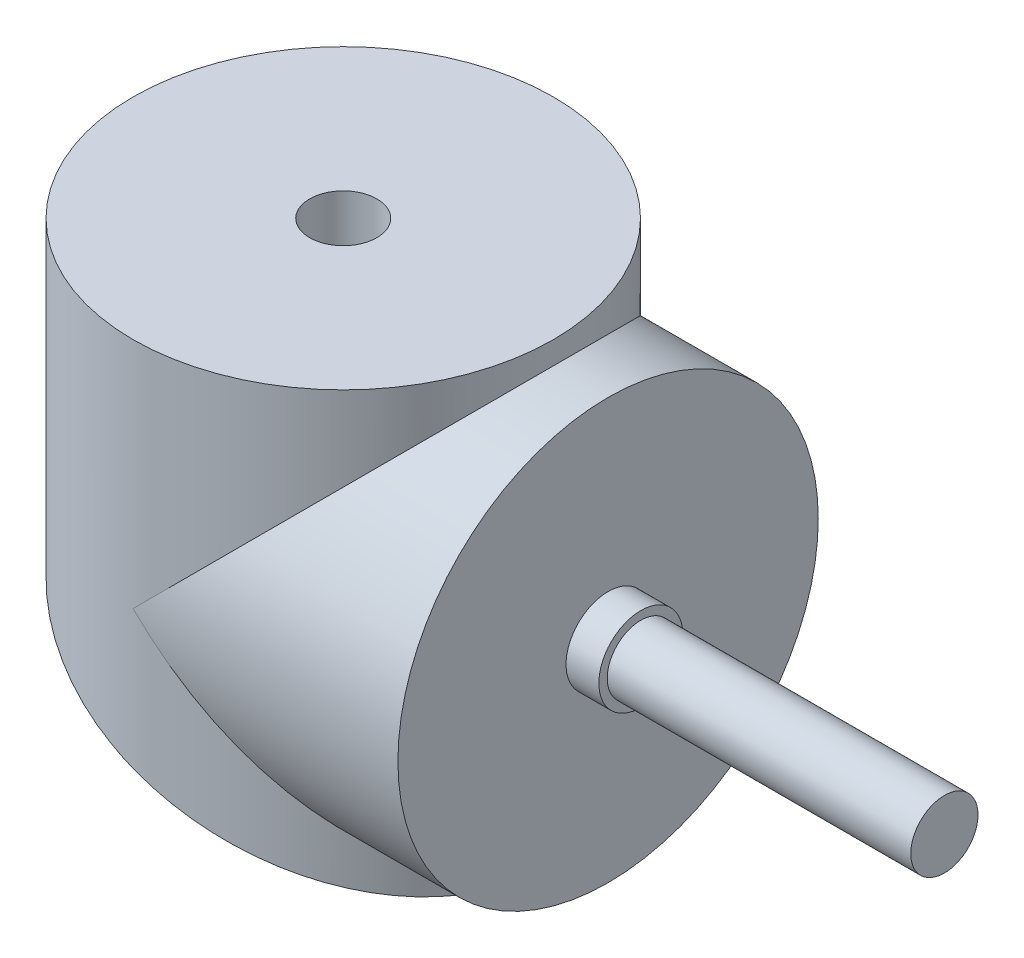
ISO-10303-21;
HEADER;
FILE_DESCRIPTION(('STEP AP214'),'2;1');
FILE_NAME('part.step','',(''),(''),'','','');
FILE_SCHEMA(('AUTOMOTIVE_DESIGN { 1 0 10303 214 1 1 1 1 }'));
ENDSEC;
DATA;
#1=APPLICATION_CONTEXT('core data for automotive mechanical design processes');
#2=APPLICATION_PROTOCOL_DEFINITION('international standard','automotive_design',2000,#1);
#3=PRODUCT_CONTEXT('',#1,'mechanical');
#4=PRODUCT('Part','Part','',(#3));
#5=PRODUCT_RELATED_PRODUCT_CATEGORY('part','',(#4));
#6=PRODUCT_DEFINITION_FORMATION('','',#4);
#7=PRODUCT_DEFINITION_CONTEXT('part definition',#1,'design');
#8=PRODUCT_DEFINITION('design','',#6,#7);
#9=PRODUCT_DEFINITION_SHAPE('','',#8);
#10=(LENGTH_UNIT() NAMED_UNIT(*) SI_UNIT(.MILLI.,.METRE.));
#11=(NAMED_UNIT(*) PLANE_ANGLE_UNIT() SI_UNIT($,.RADIAN.));
#12=(NAMED_UNIT(*) SI_UNIT($,.STERADIAN.) SOLID_ANGLE_UNIT());
#13=UNCERTAINTY_MEASURE_WITH_UNIT(LENGTH_MEASURE(1.E-05),#10,'distance_accuracy_value','');
#14=(GEOMETRIC_REPRESENTATION_CONTEXT(3) GLOBAL_UNCERTAINTY_ASSIGNED_CONTEXT((#13)) GLOBAL_UNIT_ASSIGNED_CONTEXT((#10,
#11,#12)) REPRESENTATION_CONTEXT('',''));
#15=CARTESIAN_POINT('',(0.,0.,0.));
#16=DIRECTION('',(0.,0.,1.));
#17=DIRECTION('',(1.,0.,0.));
#18=AXIS2_PLACEMENT_3D('',#15,#16,#17);
#19=CARTESIAN_POINT('',(0.,-39.70459341,0.));
#20=DIRECTION('',(0.,1.,0.));
#21=DIRECTION('',(0.,0.,1.));
#22=AXIS2_PLACEMENT_3D('',#19,#20,#21);
#23=CYLINDRICAL_SURFACE('',#22,37.5);
#24=CARTESIAN_POINT('',(0.,-24.7045790352276,0.));
#25=DIRECTION('',(0.371390983173378,0.928476568157491,0.));
#26=DIRECTION('',(-0.928476568157491,0.371390983173378,0.));
#27=AXIS2_PLACEMENT_3D('',#24,#25,#26);
#28=ELLIPSE('',#27,40.3887413921674,37.5);
#29=CARTESIAN_POINT('',(-37.5,-9.70456466045524,0.));
#30=VERTEX_POINT('',#29);
#31=EDGE_CURVE('E81',#30,#30,#28,.F.);
#32=ORIENTED_EDGE('',*,*,#31,.F.);
#33=EDGE_LOOP('',(#32));
#34=FACE_BOUND('',#33,.T.);
#35=CARTESIAN_POINT('',(0.,41.55,0.));
#36=DIRECTION('',(0.,1.,0.));
#37=DIRECTION('',(0.,0.,1.));
#38=AXIS2_PLACEMENT_3D('',#35,#36,#37);
#39=CIRCLE('',#38,37.5);
#40=CARTESIAN_POINT('',(0.,41.55,37.5));
#41=VERTEX_POINT('',#40);
#42=EDGE_CURVE('E66',#41,#41,#39,.T.);
#43=ORIENTED_EDGE('',*,*,#42,.F.);
#44=EDGE_LOOP('',(#43));
#45=FACE_BOUND('',#44,.T.);
#46=CARTESIAN_POINT('',(0.,0.,0.));
#47=DIRECTION('',(-0.707106781186547,0.707106781186547,0.));
#48=DIRECTION('',(-0.707106781186547,-0.707106781186547,0.));
#49=AXIS2_PLACEMENT_3D('',#46,#47,#48);
#50=ELLIPSE('',#49,53.0330085889911,37.5);
#51=CARTESIAN_POINT('',(0.,0.,-37.5));
#52=VERTEX_POINT('',#51);
#53=CARTESIAN_POINT('',(0.,0.,37.5));
#54=VERTEX_POINT('',#53);
#55=EDGE_CURVE('E55',#52,#54,#50,.F.);
#56=ORIENTED_EDGE('',*,*,#55,.F.);
#57=CARTESIAN_POINT('',(0.,0.,0.));
#58=DIRECTION('',(-0.707106781186547,-0.707106781186547,0.));
#59=DIRECTION('',(-0.707106781186547,0.707106781186547,0.));
#60=AXIS2_PLACEMENT_3D('',#57,#58,#59);
#61=ELLIPSE('',#60,53.0330085889911,37.5);
#62=EDGE_CURVE('E63',#54,#52,#61,.F.);
#63=ORIENTED_EDGE('',*,*,#62,.F.);
#64=EDGE_LOOP('',(#56,#63));
#65=FACE_BOUND('',#64,.T.);
#66=ADVANCED_FACE('F45',(#34,#45,#65),#23,.T.);
#67=CARTESIAN_POINT('',(0.,41.55,0.));
#68=DIRECTION('',(0.,1.,0.));
#69=DIRECTION('',(0.,0.,1.));
#70=AXIS2_PLACEMENT_3D('',#67,#68,#69);
#71=PLANE('',#70);
#72=CARTESIAN_POINT('',(0.,41.55,0.));
#73=DIRECTION('',(0.,1.,0.));
#74=DIRECTION('',(0.,0.,1.));
#75=AXIS2_PLACEMENT_3D('',#72,#73,#74);
#76=CIRCLE('',#75,6.);
#77=CARTESIAN_POINT('',(0.,41.55,-6.));
#78=VERTEX_POINT('',#77);
#79=EDGE_CURVE('E49',#78,#78,#76,.F.);
#80=ORIENTED_EDGE('',*,*,#79,.T.);
#81=EDGE_LOOP('',(#80));
#82=FACE_BOUND('',#81,.T.);
#83=ORIENTED_EDGE('',*,*,#42,.T.);
#84=EDGE_LOOP('',(#83));
#85=FACE_BOUND('',#84,.T.);
#86=ADVANCED_FACE('F100',(#82,#85),#71,.T.);
#87=CARTESIAN_POINT('',(47.25,0.,0.));
#88=DIRECTION('',(-1.,0.,0.));
#89=DIRECTION('',(0.,0.,1.));
#90=AXIS2_PLACEMENT_3D('',#87,#88,#89);
#91=CYLINDRICAL_SURFACE('',#90,37.5);
#92=CARTESIAN_POINT('',(47.25,0.,0.));
#93=DIRECTION('',(1.,0.,0.));
#94=DIRECTION('',(0.,0.,-1.));
#95=AXIS2_PLACEMENT_3D('',#92,#93,#94);
#96=CIRCLE('',#95,37.5);
#97=CARTESIAN_POINT('',(47.25,0.,-37.5));
#98=VERTEX_POINT('',#97);
#99=EDGE_CURVE('E11',#98,#98,#96,.T.);
#100=ORIENTED_EDGE('',*,*,#99,.F.);
#101=EDGE_LOOP('',(#100));
#102=FACE_BOUND('',#101,.T.);
#103=ORIENTED_EDGE('',*,*,#62,.T.);
#104=ORIENTED_EDGE('',*,*,#55,.T.);
#105=EDGE_LOOP('',(#103,#104));
#106=FACE_BOUND('',#105,.T.);
#107=ADVANCED_FACE('F47',(#102,#106),#91,.T.);
#108=CARTESIAN_POINT('',(47.25,0.,0.));
#109=DIRECTION('',(1.,0.,0.));
#110=DIRECTION('',(0.,0.,-1.));
#111=AXIS2_PLACEMENT_3D('',#108,#109,#110);
#112=PLANE('',#111);
#113=CARTESIAN_POINT('',(47.25,0.,0.));
#114=DIRECTION('',(1.,0.,0.));
#115=DIRECTION('',(0.,0.,-1.));
#116=AXIS2_PLACEMENT_3D('',#113,#114,#115);
#117=CIRCLE('',#116,7.5);
#118=CARTESIAN_POINT('',(47.25,0.,-7.5));
#119=VERTEX_POINT('',#118);
#120=EDGE_CURVE('E84',#119,#119,#117,.T.);
#121=ORIENTED_EDGE('',*,*,#120,.F.);
#122=EDGE_LOOP('',(#121));
#123=FACE_BOUND('',#122,.T.);
#124=ORIENTED_EDGE('',*,*,#99,.T.);
#125=EDGE_LOOP('',(#124));
#126=FACE_BOUND('',#125,.T.);
#127=ADVANCED_FACE('F114',(#123,#126),#112,.T.);
#128=CARTESIAN_POINT('',(-37.5,-9.70456466045523,-37.5));
#129=DIRECTION('',(0.371390983173378,0.928476568157491,0.));
#130=DIRECTION('',(-0.928476568157491,0.371390983173378,0.));
#131=AXIS2_PLACEMENT_3D('',#128,#129,#130);
#132=PLANE('',#131);
#133=ORIENTED_EDGE('',*,*,#31,.T.);
#134=EDGE_LOOP('',(#133));
#135=FACE_BOUND('',#134,.T.);
#136=ADVANCED_FACE('F116',(#135),#132,.F.);
#137=CARTESIAN_POINT('',(53.1,0.,0.));
#138=DIRECTION('',(-1.,0.,0.));
#139=DIRECTION('',(0.,0.,1.));
#140=AXIS2_PLACEMENT_3D('',#137,#138,#139);
#141=CYLINDRICAL_SURFACE('',#140,7.5);
#142=CARTESIAN_POINT('',(53.1,0.,0.));
#143=DIRECTION('',(1.,0.,0.));
#144=DIRECTION('',(0.,0.,-1.));
#145=AXIS2_PLACEMENT_3D('',#142,#143,#144);
#146=CIRCLE('',#145,7.5);
#147=CARTESIAN_POINT('',(53.1,0.,-7.5));
#148=VERTEX_POINT('',#147);
#149=EDGE_CURVE('E75',#148,#148,#146,.T.);
#150=ORIENTED_EDGE('',*,*,#149,.F.);
#151=EDGE_LOOP('',(#150));
#152=FACE_BOUND('',#151,.T.);
#153=ORIENTED_EDGE('',*,*,#120,.T.);
#154=EDGE_LOOP('',(#153));
#155=FACE_BOUND('',#154,.T.);
#156=ADVANCED_FACE('F122',(#152,#155),#141,.T.);
#157=CARTESIAN_POINT('',(53.1,0.,0.));
#158=DIRECTION('',(1.,0.,0.));
#159=DIRECTION('',(0.,0.,-1.));
#160=AXIS2_PLACEMENT_3D('',#157,#158,#159);
#161=PLANE('',#160);
#162=CARTESIAN_POINT('',(53.1,0.,0.));
#163=DIRECTION('',(1.,0.,0.));
#164=DIRECTION('',(0.,0.,-1.));
#165=AXIS2_PLACEMENT_3D('',#162,#163,#164);
#166=CIRCLE('',#165,6.);
#167=CARTESIAN_POINT('',(53.1,0.,-6.));
#168=VERTEX_POINT('',#167);
#169=EDGE_CURVE('E71',#168,#168,#166,.T.);
#170=ORIENTED_EDGE('',*,*,#169,.F.);
#171=EDGE_LOOP('',(#170));
#172=FACE_BOUND('',#171,.T.);
#173=ORIENTED_EDGE('',*,*,#149,.T.);
#174=EDGE_LOOP('',(#173));
#175=FACE_BOUND('',#174,.T.);
#176=ADVANCED_FACE('F129',(#172,#175),#161,.T.);
#177=CARTESIAN_POINT('',(107.25,0.,0.));
#178=DIRECTION('',(1.,0.,0.));
#179=DIRECTION('',(0.,0.,-1.));
#180=AXIS2_PLACEMENT_3D('',#177,#178,#179);
#181=PLANE('',#180);
#182=CARTESIAN_POINT('',(107.25,0.,0.));
#183=DIRECTION('',(1.,0.,0.));
#184=DIRECTION('',(0.,0.,-1.));
#185=AXIS2_PLACEMENT_3D('',#182,#183,#184);
#186=CIRCLE('',#185,6.);
#187=CARTESIAN_POINT('',(107.25,0.,-6.));
#188=VERTEX_POINT('',#187);
#189=EDGE_CURVE('E74',#188,#188,#186,.T.);
#190=ORIENTED_EDGE('',*,*,#189,.T.);
#191=EDGE_LOOP('',(#190));
#192=FACE_BOUND('',#191,.T.);
#193=ADVANCED_FACE('F135',(#192),#181,.T.);
#194=CARTESIAN_POINT('',(107.25,0.,0.));
#195=DIRECTION('',(-1.,0.,0.));
#196=DIRECTION('',(0.,0.,1.));
#197=AXIS2_PLACEMENT_3D('',#194,#195,#196);
#198=CYLINDRICAL_SURFACE('',#197,6.);
#199=ORIENTED_EDGE('',*,*,#169,.T.);
#200=EDGE_LOOP('',(#199));
#201=FACE_BOUND('',#200,.T.);
#202=ORIENTED_EDGE('',*,*,#189,.F.);
#203=EDGE_LOOP('',(#202));
#204=FACE_BOUND('',#203,.T.);
#205=ADVANCED_FACE('F141',(#201,#204),#198,.T.);
#206=CARTESIAN_POINT('',(0.,41.550012,0.));
#207=DIRECTION('',(0.,-1.,0.));
#208=DIRECTION('',(0.,0.,-1.));
#209=AXIS2_PLACEMENT_3D('',#206,#207,#208);
#210=CYLINDRICAL_SURFACE('',#209,6.);
#211=CARTESIAN_POINT('',(0.,-16.6,0.));
#212=DIRECTION('',(0.,1.,0.));
#213=DIRECTION('',(0.,0.,1.));
#214=AXIS2_PLACEMENT_3D('',#211,#212,#213);
#215=CIRCLE('',#214,6.);
#216=CARTESIAN_POINT('',(0.,-16.6,-6.));
#217=VERTEX_POINT('',#216);
#218=EDGE_CURVE('E92',#217,#217,#215,.T.);
#219=CARTESIAN_POINT('',(0.,41.55,-6.));
#220=CARTESIAN_POINT('',(0.,40.9442708333333,-6.));
#221=CARTESIAN_POINT('',(0.,40.3385416666667,-6.));
#222=CARTESIAN_POINT('',(0.,39.1270833333333,-6.));
#223=CARTESIAN_POINT('',(0.,38.5213541666667,-6.));
#224=CARTESIAN_POINT('',(0.,37.3098958333333,-6.));
#225=CARTESIAN_POINT('',(0.,36.7041666666667,-6.));
#226=CARTESIAN_POINT('',(0.,35.4927083333333,-6.));
#227=CARTESIAN_POINT('',(0.,34.8869791666667,-6.));
#228=CARTESIAN_POINT('',(0.,33.6755208333333,-6.));
#229=CARTESIAN_POINT('',(0.,33.0697916666667,-6.));
#230=CARTESIAN_POINT('',(0.,31.8583333333333,-6.));
#231=CARTESIAN_POINT('',(0.,31.2526041666667,-6.));
#232=CARTESIAN_POINT('',(0.,30.0411458333333,-6.));
#233=CARTESIAN_POINT('',(0.,29.4354166666667,-6.));
#234=CARTESIAN_POINT('',(0.,28.2239583333333,-6.));
#235=CARTESIAN_POINT('',(0.,27.6182291666667,-6.));
#236=CARTESIAN_POINT('',(0.,26.4067708333333,-6.));
#237=CARTESIAN_POINT('',(0.,25.8010416666667,-6.));
#238=CARTESIAN_POINT('',(0.,24.5895833333333,-6.));
#239=CARTESIAN_POINT('',(0.,23.9838541666667,-6.));
#240=CARTESIAN_POINT('',(0.,22.7723958333333,-6.));
#241=CARTESIAN_POINT('',(0.,22.1666666666667,-6.));
#242=CARTESIAN_POINT('',(0.,20.9552083333333,-6.));
#243=CARTESIAN_POINT('',(0.,20.3494791666667,-6.));
#244=CARTESIAN_POINT('',(0.,19.1380208333333,-6.));
#245=CARTESIAN_POINT('',(0.,18.5322916666667,-6.));
#246=CARTESIAN_POINT('',(0.,17.3208333333333,-6.));
#247=CARTESIAN_POINT('',(0.,16.7151041666667,-6.));
#248=CARTESIAN_POINT('',(0.,15.5036458333333,-6.));
#249=CARTESIAN_POINT('',(0.,14.8979166666667,-6.));
#250=CARTESIAN_POINT('',(0.,13.6864583333333,-6.));
#251=CARTESIAN_POINT('',(0.,13.0807291666667,-6.));
#252=CARTESIAN_POINT('',(0.,11.8692708333333,-6.));
#253=CARTESIAN_POINT('',(0.,11.2635416666667,-6.));
#254=CARTESIAN_POINT('',(0.,10.0520833333333,-6.));
#255=CARTESIAN_POINT('',(0.,9.44635416666666,-6.));
#256=CARTESIAN_POINT('',(0.,8.23489583333333,-6.));
#257=CARTESIAN_POINT('',(0.,7.62916666666667,-6.));
#258=CARTESIAN_POINT('',(0.,6.41770833333333,-6.));
#259=CARTESIAN_POINT('',(0.,5.81197916666666,-6.));
#260=CARTESIAN_POINT('',(0.,4.60052083333332,-6.));
#261=CARTESIAN_POINT('',(0.,3.99479166666666,-6.));
#262=CARTESIAN_POINT('',(0.,2.78333333333333,-6.));
#263=CARTESIAN_POINT('',(0.,2.17760416666666,-6.));
#264=CARTESIAN_POINT('',(0.,0.966145833333327,-6.));
#265=CARTESIAN_POINT('',(0.,0.360416666666662,-6.));
#266=CARTESIAN_POINT('',(0.,-0.85104166666667,-6.));
#267=CARTESIAN_POINT('',(0.,-1.45677083333334,-6.));
#268=CARTESIAN_POINT('',(0.,-2.66822916666667,-6.));
#269=CARTESIAN_POINT('',(0.,-3.27395833333333,-6.));
#270=CARTESIAN_POINT('',(0.,-4.48541666666667,-6.));
#271=CARTESIAN_POINT('',(0.,-5.09114583333334,-6.));
#272=CARTESIAN_POINT('',(0.,-6.30260416666668,-6.));
#273=CARTESIAN_POINT('',(0.,-6.90833333333334,-6.));
#274=CARTESIAN_POINT('',(0.,-8.11979166666667,-6.));
#275=CARTESIAN_POINT('',(0.,-8.72552083333334,-6.));
#276=CARTESIAN_POINT('',(0.,-9.93697916666667,-6.));
#277=CARTESIAN_POINT('',(0.,-10.5427083333333,-6.));
#278=CARTESIAN_POINT('',(0.,-11.7541666666667,-6.));
#279=CARTESIAN_POINT('',(0.,-12.3598958333333,-6.));
#280=CARTESIAN_POINT('',(0.,-13.5713541666667,-6.));
#281=CARTESIAN_POINT('',(0.,-14.1770833333333,-6.));
#282=CARTESIAN_POINT('',(0.,-15.3885416666667,-6.));
#283=CARTESIAN_POINT('',(0.,-15.9942708333333,-6.));
#284=CARTESIAN_POINT('',(0.,-16.6,-6.));
#285=B_SPLINE_CURVE_WITH_KNOTS('',3,(#219,#220,#221,#222,#223,#224,#225,#226,#227,#228,#229,
#230,#231,#232,#233,#234,#235,#236,#237,#238,#239,#240,#241,#242,#243,#244,#245,#246,#247,#248,
#249,#250,#251,#252,#253,#254,#255,#256,#257,#258,#259,#260,#261,#262,#263,#264,#265,#266,#267,
#268,#269,#270,#271,#272,#273,#274,#275,#276,#277,#278,#279,#280,#281,#282,#283,#284),
.UNSPECIFIED.,.F.,.F.,(4,2,2,2,2,2,2,2,2,2,2,2,2,2,2,2,2,2,2,2,2,2,2,2,2,2,2,2,2,2,2,2,4),(0.,
1.8171875,3.634375,5.4515625,7.26875,9.0859375,10.903125,12.7203125,14.5375,16.3546875,
18.171875,19.9890625,21.80625,23.6234375,25.440625,27.2578125,29.075,30.8921875,32.709375,
34.5265625,36.34375,38.1609375,39.978125,41.7953125,43.6125,45.4296875,47.246875,49.0640625,
50.88125,52.6984375,54.515625,56.3328125,58.15),.UNSPECIFIED.);
#286=EDGE_CURVE('BSEAM144',#78,#217,#285,.T.);
#287=ORIENTED_EDGE('',*,*,#79,.F.);
#288=ORIENTED_EDGE('',*,*,#218,.F.);
#289=ORIENTED_EDGE('',*,*,#286,.T.);
#290=ORIENTED_EDGE('',*,*,#286,.F.);
#291=EDGE_LOOP('',(#287,#289,#288,#290));
#292=FACE_BOUND('',#291,.T.);
#293=ADVANCED_FACE('F144',(#292),#210,.F.);
#294=CARTESIAN_POINT('',(0.,-16.6,0.));
#295=DIRECTION('',(0.,1.,0.));
#296=DIRECTION('',(0.,0.,1.));
#297=AXIS2_PLACEMENT_3D('',#294,#295,#296);
#298=PLANE('',#297);
#299=ORIENTED_EDGE('',*,*,#218,.T.);
#300=EDGE_LOOP('',(#299));
#301=FACE_BOUND('',#300,.T.);
#302=ADVANCED_FACE('F148',(#301),#298,.T.);
#303=CLOSED_SHELL('',(#66,#86,#107,#127,#136,#156,#176,#193,#205,#293,#302));
#304=MANIFOLD_SOLID_BREP('B2',#303);
#305=ADVANCED_BREP_SHAPE_REPRESENTATION('',(#18,#304),#14);
#306=SHAPE_DEFINITION_REPRESENTATION(#9,#305);
ENDSEC;
END-ISO-10303-21;
